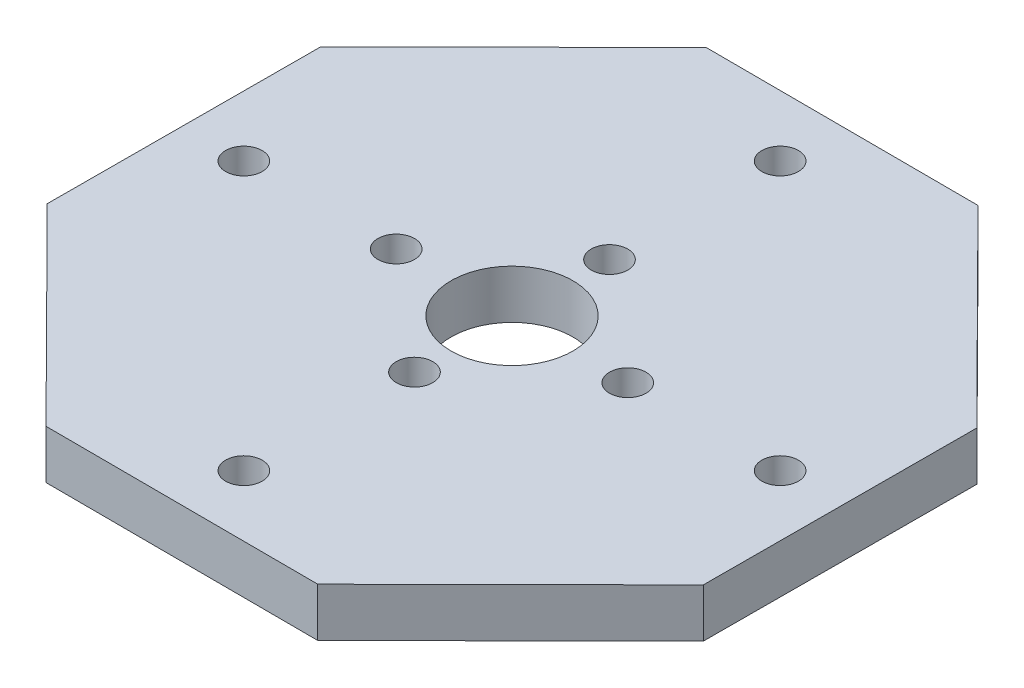
ISO-10303-21;
HEADER;
FILE_DESCRIPTION(('STEP AP214'),'2;1');
FILE_NAME('part.step','',(''),(''),'','','');
FILE_SCHEMA(('AUTOMOTIVE_DESIGN { 1 0 10303 214 1 1 1 1 }'));
ENDSEC;
DATA;
#1=APPLICATION_CONTEXT('core data for automotive mechanical design processes');
#2=APPLICATION_PROTOCOL_DEFINITION('international standard','automotive_design',2000,#1);
#3=PRODUCT_CONTEXT('',#1,'mechanical');
#4=PRODUCT('Part','Part','',(#3));
#5=PRODUCT_RELATED_PRODUCT_CATEGORY('part','',(#4));
#6=PRODUCT_DEFINITION_FORMATION('','',#4);
#7=PRODUCT_DEFINITION_CONTEXT('part definition',#1,'design');
#8=PRODUCT_DEFINITION('design','',#6,#7);
#9=PRODUCT_DEFINITION_SHAPE('','',#8);
#10=(LENGTH_UNIT() NAMED_UNIT(*) SI_UNIT(.MILLI.,.METRE.));
#11=(NAMED_UNIT(*) PLANE_ANGLE_UNIT() SI_UNIT($,.RADIAN.));
#12=(NAMED_UNIT(*) SI_UNIT($,.STERADIAN.) SOLID_ANGLE_UNIT());
#13=UNCERTAINTY_MEASURE_WITH_UNIT(LENGTH_MEASURE(1.E-05),#10,'distance_accuracy_value','');
#14=(GEOMETRIC_REPRESENTATION_CONTEXT(3) GLOBAL_UNCERTAINTY_ASSIGNED_CONTEXT((#13)) GLOBAL_UNIT_ASSIGNED_CONTEXT((#10,
#11,#12)) REPRESENTATION_CONTEXT('',''));
#15=CARTESIAN_POINT('',(0.,0.,0.));
#16=DIRECTION('',(0.,0.,1.));
#17=DIRECTION('',(1.,0.,0.));
#18=AXIS2_PLACEMENT_3D('',#15,#16,#17);
#19=CARTESIAN_POINT('',(0.,2.,0.));
#20=DIRECTION('',(0.,1.,0.));
#21=DIRECTION('',(0.,0.,1.));
#22=AXIS2_PLACEMENT_3D('',#19,#20,#21);
#23=PLANE('',#22);
#24=CARTESIAN_POINT('',(9.5,2.,0.));
#25=DIRECTION('',(0.,1.,0.));
#26=DIRECTION('',(0.,0.,1.));
#27=AXIS2_PLACEMENT_3D('',#24,#25,#26);
#28=CIRCLE('',#27,1.5);
#29=CARTESIAN_POINT('',(9.5,2.,1.5));
#30=VERTEX_POINT('',#29);
#31=EDGE_CURVE('E222',#30,#30,#28,.T.);
#32=ORIENTED_EDGE('',*,*,#31,.F.);
#33=EDGE_LOOP('',(#32));
#34=FACE_BOUND('',#33,.T.);
#35=CARTESIAN_POINT('',(-22.,2.,0.));
#36=DIRECTION('',(0.,1.,0.));
#37=DIRECTION('',(0.,0.,1.));
#38=AXIS2_PLACEMENT_3D('',#35,#36,#37);
#39=CIRCLE('',#38,1.50000000000022);
#40=CARTESIAN_POINT('',(-22.,2.,1.50000000000022));
#41=VERTEX_POINT('',#40);
#42=EDGE_CURVE('E210',#41,#41,#39,.T.);
#43=ORIENTED_EDGE('',*,*,#42,.F.);
#44=EDGE_LOOP('',(#43));
#45=FACE_BOUND('',#44,.T.);
#46=CARTESIAN_POINT('',(22.,2.,0.));
#47=DIRECTION('',(0.,1.,0.));
#48=DIRECTION('',(0.,0.,1.));
#49=AXIS2_PLACEMENT_3D('',#46,#47,#48);
#50=CIRCLE('',#49,1.50000000000008);
#51=CARTESIAN_POINT('',(22.,2.,1.50000000000008));
#52=VERTEX_POINT('',#51);
#53=EDGE_CURVE('E198',#52,#52,#50,.T.);
#54=ORIENTED_EDGE('',*,*,#53,.F.);
#55=EDGE_LOOP('',(#54));
#56=FACE_BOUND('',#55,.T.);
#57=CARTESIAN_POINT('',(0.,2.,0.));
#58=DIRECTION('',(0.,1.,0.));
#59=DIRECTION('',(0.,0.,1.));
#60=AXIS2_PLACEMENT_3D('',#57,#58,#59);
#61=CIRCLE('',#60,5.);
#62=CARTESIAN_POINT('',(0.,2.,5.));
#63=VERTEX_POINT('',#62);
#64=EDGE_CURVE('E186',#63,#63,#61,.T.);
#65=ORIENTED_EDGE('',*,*,#64,.F.);
#66=EDGE_LOOP('',(#65));
#67=FACE_BOUND('',#66,.T.);
#68=DIRECTION('',(-0.704829536822876,0.,-0.709376715167654));
#69=VECTOR('',#68,1.);
#70=CARTESIAN_POINT('',(27.0358200489824,2.,-11.0968941753564));
#71=LINE('',#70,#69);
#72=CARTESIAN_POINT('',(27.0358200489824,2.,-11.0968941753564));
#73=VERTEX_POINT('',#72);
#74=CARTESIAN_POINT('',(11.2705225700707,2.,-26.9639008130787));
#75=VERTEX_POINT('',#74);
#76=EDGE_CURVE('E149',#73,#75,#71,.T.);
#77=ORIENTED_EDGE('',*,*,#76,.T.);
#78=DIRECTION('',(-0.999994830778915,0.,-0.00321534064285705));
#79=VECTOR('',#78,1.);
#80=CARTESIAN_POINT('',(11.2705225700707,2.,-26.9639008130787));
#81=LINE('',#80,#79);
#82=CARTESIAN_POINT('',(-11.0968941753564,2.,-27.0358200489824));
#83=VERTEX_POINT('',#82);
#84=EDGE_CURVE('E97',#75,#83,#81,.T.);
#85=ORIENTED_EDGE('',*,*,#84,.T.);
#86=DIRECTION('',(-0.709376715167653,0.,0.704829536822876));
#87=VECTOR('',#86,1.);
#88=CARTESIAN_POINT('',(-11.0968941753564,2.,-27.0358200489824));
#89=LINE('',#88,#87);
#90=CARTESIAN_POINT('',(-26.9639008130787,2.,-11.2705225700707));
#91=VERTEX_POINT('',#90);
#92=EDGE_CURVE('E164',#83,#91,#89,.T.);
#93=ORIENTED_EDGE('',*,*,#92,.T.);
#94=DIRECTION('',(-0.0032153406428569,0.,0.999994830778915));
#95=VECTOR('',#94,1.);
#96=CARTESIAN_POINT('',(-26.9639008130787,2.,-11.2705225700707));
#97=LINE('',#96,#95);
#98=CARTESIAN_POINT('',(-27.0358200489824,2.,11.0968941753564));
#99=VERTEX_POINT('',#98);
#100=EDGE_CURVE('E177',#91,#99,#97,.T.);
#101=ORIENTED_EDGE('',*,*,#100,.T.);
#102=DIRECTION('',(0.704829536822876,0.,0.709376715167654));
#103=VECTOR('',#102,1.);
#104=CARTESIAN_POINT('',(-27.0358200489824,2.,11.0968941753564));
#105=LINE('',#104,#103);
#106=CARTESIAN_POINT('',(-11.2705225700707,2.,26.9639008130787));
#107=VERTEX_POINT('',#106);
#108=EDGE_CURVE('E116',#99,#107,#105,.T.);
#109=ORIENTED_EDGE('',*,*,#108,.T.);
#110=DIRECTION('',(0.999994830778915,0.,0.0032153406428569));
#111=VECTOR('',#110,1.);
#112=CARTESIAN_POINT('',(-11.2705225700707,2.,26.9639008130787));
#113=LINE('',#112,#111);
#114=CARTESIAN_POINT('',(11.0968941753564,2.,27.0358200489824));
#115=VERTEX_POINT('',#114);
#116=EDGE_CURVE('E110',#107,#115,#113,.T.);
#117=ORIENTED_EDGE('',*,*,#116,.T.);
#118=DIRECTION('',(0.709376715167654,0.,-0.704829536822876));
#119=VECTOR('',#118,1.);
#120=CARTESIAN_POINT('',(11.0968941753564,2.,27.0358200489824));
#121=LINE('',#120,#119);
#122=CARTESIAN_POINT('',(26.9639008130787,2.,11.2705225700707));
#123=VERTEX_POINT('',#122);
#124=EDGE_CURVE('E114',#115,#123,#121,.T.);
#125=ORIENTED_EDGE('',*,*,#124,.T.);
#126=DIRECTION('',(0.00321534064285705,0.,-0.999994830778915));
#127=VECTOR('',#126,1.);
#128=CARTESIAN_POINT('',(26.9639008130787,2.,11.2705225700707));
#129=LINE('',#128,#127);
#130=EDGE_CURVE('E54',#123,#73,#129,.T.);
#131=ORIENTED_EDGE('',*,*,#130,.T.);
#132=EDGE_LOOP('',(#77,#85,#93,#101,#109,#117,#125,#131));
#133=FACE_BOUND('',#132,.T.);
#134=CARTESIAN_POINT('',(0.,2.,-22.));
#135=DIRECTION('',(0.,1.,0.));
#136=DIRECTION('',(0.,0.,1.));
#137=AXIS2_PLACEMENT_3D('',#134,#135,#136);
#138=CIRCLE('',#137,1.5);
#139=CARTESIAN_POINT('',(0.,2.,-20.5));
#140=VERTEX_POINT('',#139);
#141=EDGE_CURVE('E138',#140,#140,#138,.T.);
#142=ORIENTED_EDGE('',*,*,#141,.F.);
#143=EDGE_LOOP('',(#142));
#144=FACE_BOUND('',#143,.T.);
#145=CARTESIAN_POINT('',(-9.5,2.,0.));
#146=DIRECTION('',(0.,1.,0.));
#147=DIRECTION('',(0.,0.,1.));
#148=AXIS2_PLACEMENT_3D('',#145,#146,#147);
#149=CIRCLE('',#148,1.5);
#150=CARTESIAN_POINT('',(-9.5,2.,1.5));
#151=VERTEX_POINT('',#150);
#152=EDGE_CURVE('E192',#151,#151,#149,.T.);
#153=ORIENTED_EDGE('',*,*,#152,.F.);
#154=EDGE_LOOP('',(#153));
#155=FACE_BOUND('',#154,.T.);
#156=CARTESIAN_POINT('',(0.,2.,22.));
#157=DIRECTION('',(0.,1.,0.));
#158=DIRECTION('',(0.,0.,1.));
#159=AXIS2_PLACEMENT_3D('',#156,#157,#158);
#160=CIRCLE('',#159,1.50000000000015);
#161=CARTESIAN_POINT('',(0.,2.,23.5000000000001));
#162=VERTEX_POINT('',#161);
#163=EDGE_CURVE('E204',#162,#162,#160,.T.);
#164=ORIENTED_EDGE('',*,*,#163,.F.);
#165=EDGE_LOOP('',(#164));
#166=FACE_BOUND('',#165,.T.);
#167=CARTESIAN_POINT('',(0.,2.,8.));
#168=DIRECTION('',(0.,1.,0.));
#169=DIRECTION('',(0.,0.,1.));
#170=AXIS2_PLACEMENT_3D('',#167,#168,#169);
#171=CIRCLE('',#170,1.5);
#172=CARTESIAN_POINT('',(0.,2.,9.5));
#173=VERTEX_POINT('',#172);
#174=EDGE_CURVE('E216',#173,#173,#171,.T.);
#175=ORIENTED_EDGE('',*,*,#174,.F.);
#176=EDGE_LOOP('',(#175));
#177=FACE_BOUND('',#176,.T.);
#178=CARTESIAN_POINT('',(0.,2.,-8.));
#179=DIRECTION('',(0.,1.,0.));
#180=DIRECTION('',(0.,0.,1.));
#181=AXIS2_PLACEMENT_3D('',#178,#179,#180);
#182=CIRCLE('',#181,1.5);
#183=CARTESIAN_POINT('',(0.,2.,-6.5));
#184=VERTEX_POINT('',#183);
#185=EDGE_CURVE('E228',#184,#184,#182,.T.);
#186=ORIENTED_EDGE('',*,*,#185,.F.);
#187=EDGE_LOOP('',(#186));
#188=FACE_BOUND('',#187,.T.);
#189=ADVANCED_FACE('F37',(#34,#45,#56,#67,#133,#144,#155,#166,#177,#188),#23,.T.);
#190=CARTESIAN_POINT('',(0.,-2.,0.));
#191=DIRECTION('',(0.,1.,0.));
#192=DIRECTION('',(0.,0.,1.));
#193=AXIS2_PLACEMENT_3D('',#190,#191,#192);
#194=PLANE('',#193);
#195=DIRECTION('',(-0.704829536822876,0.,-0.709376715167654));
#196=VECTOR('',#195,1.);
#197=CARTESIAN_POINT('',(27.0358200489824,-2.,-11.0968941753564));
#198=LINE('',#197,#196);
#199=CARTESIAN_POINT('',(27.0358200489824,-2.,-11.0968941753564));
#200=VERTEX_POINT('',#199);
#201=CARTESIAN_POINT('',(11.2705225700707,-2.,-26.9639008130787));
#202=VERTEX_POINT('',#201);
#203=EDGE_CURVE('E134',#200,#202,#198,.T.);
#204=ORIENTED_EDGE('',*,*,#203,.F.);
#205=DIRECTION('',(0.00321534064285705,0.,-0.999994830778915));
#206=VECTOR('',#205,1.);
#207=CARTESIAN_POINT('',(26.9639008130787,-2.,11.2705225700707));
#208=LINE('',#207,#206);
#209=CARTESIAN_POINT('',(26.9639008130787,-2.,11.2705225700707));
#210=VERTEX_POINT('',#209);
#211=EDGE_CURVE('E89',#210,#200,#208,.T.);
#212=ORIENTED_EDGE('',*,*,#211,.F.);
#213=DIRECTION('',(0.709376715167654,0.,-0.704829536822876));
#214=VECTOR('',#213,1.);
#215=CARTESIAN_POINT('',(11.0968941753564,-2.,27.0358200489824));
#216=LINE('',#215,#214);
#217=CARTESIAN_POINT('',(11.0968941753564,-2.,27.0358200489824));
#218=VERTEX_POINT('',#217);
#219=EDGE_CURVE('E83',#218,#210,#216,.T.);
#220=ORIENTED_EDGE('',*,*,#219,.F.);
#221=DIRECTION('',(0.999994830778915,0.,0.0032153406428569));
#222=VECTOR('',#221,1.);
#223=CARTESIAN_POINT('',(-11.2705225700707,-2.,26.9639008130787));
#224=LINE('',#223,#222);
#225=CARTESIAN_POINT('',(-11.2705225700707,-2.,26.9639008130787));
#226=VERTEX_POINT('',#225);
#227=EDGE_CURVE('E124',#226,#218,#224,.T.);
#228=ORIENTED_EDGE('',*,*,#227,.F.);
#229=DIRECTION('',(0.704829536822876,0.,0.709376715167654));
#230=VECTOR('',#229,1.);
#231=CARTESIAN_POINT('',(-27.0358200489824,-2.,11.0968941753564));
#232=LINE('',#231,#230);
#233=CARTESIAN_POINT('',(-27.0358200489824,-2.,11.0968941753564));
#234=VERTEX_POINT('',#233);
#235=EDGE_CURVE('E144',#234,#226,#232,.T.);
#236=ORIENTED_EDGE('',*,*,#235,.F.);
#237=DIRECTION('',(-0.0032153406428569,0.,0.999994830778915));
#238=VECTOR('',#237,1.);
#239=CARTESIAN_POINT('',(-26.9639008130787,-2.,-11.2705225700707));
#240=LINE('',#239,#238);
#241=CARTESIAN_POINT('',(-26.9639008130787,-2.,-11.2705225700707));
#242=VERTEX_POINT('',#241);
#243=EDGE_CURVE('E142',#242,#234,#240,.T.);
#244=ORIENTED_EDGE('',*,*,#243,.F.);
#245=DIRECTION('',(-0.709376715167653,0.,0.704829536822876));
#246=VECTOR('',#245,1.);
#247=CARTESIAN_POINT('',(-11.0968941753564,-2.,-27.0358200489824));
#248=LINE('',#247,#246);
#249=CARTESIAN_POINT('',(-11.0968941753564,-2.,-27.0358200489824));
#250=VERTEX_POINT('',#249);
#251=EDGE_CURVE('E140',#250,#242,#248,.T.);
#252=ORIENTED_EDGE('',*,*,#251,.F.);
#253=DIRECTION('',(-0.999994830778915,0.,-0.00321534064285705));
#254=VECTOR('',#253,1.);
#255=CARTESIAN_POINT('',(11.2705225700707,-2.,-26.9639008130787));
#256=LINE('',#255,#254);
#257=EDGE_CURVE('E137',#202,#250,#256,.T.);
#258=ORIENTED_EDGE('',*,*,#257,.F.);
#259=EDGE_LOOP('',(#204,#212,#220,#228,#236,#244,#252,#258));
#260=FACE_BOUND('',#259,.T.);
#261=CARTESIAN_POINT('',(0.,-2.,-22.));
#262=DIRECTION('',(0.,1.,0.));
#263=DIRECTION('',(0.,0.,1.));
#264=AXIS2_PLACEMENT_3D('',#261,#262,#263);
#265=CIRCLE('',#264,1.5);
#266=CARTESIAN_POINT('',(0.,-2.,-20.5));
#267=VERTEX_POINT('',#266);
#268=EDGE_CURVE('E183',#267,#267,#265,.T.);
#269=ORIENTED_EDGE('',*,*,#268,.T.);
#270=EDGE_LOOP('',(#269));
#271=FACE_BOUND('',#270,.T.);
#272=CARTESIAN_POINT('',(0.,-2.,0.));
#273=DIRECTION('',(0.,1.,0.));
#274=DIRECTION('',(0.,0.,1.));
#275=AXIS2_PLACEMENT_3D('',#272,#273,#274);
#276=CIRCLE('',#275,5.);
#277=CARTESIAN_POINT('',(0.,-2.,5.));
#278=VERTEX_POINT('',#277);
#279=EDGE_CURVE('E189',#278,#278,#276,.T.);
#280=ORIENTED_EDGE('',*,*,#279,.T.);
#281=EDGE_LOOP('',(#280));
#282=FACE_BOUND('',#281,.T.);
#283=CARTESIAN_POINT('',(-9.5,-2.,0.));
#284=DIRECTION('',(0.,1.,0.));
#285=DIRECTION('',(0.,0.,1.));
#286=AXIS2_PLACEMENT_3D('',#283,#284,#285);
#287=CIRCLE('',#286,1.5);
#288=CARTESIAN_POINT('',(-9.5,-2.,1.5));
#289=VERTEX_POINT('',#288);
#290=EDGE_CURVE('E195',#289,#289,#287,.T.);
#291=ORIENTED_EDGE('',*,*,#290,.T.);
#292=EDGE_LOOP('',(#291));
#293=FACE_BOUND('',#292,.T.);
#294=CARTESIAN_POINT('',(22.,-2.,0.));
#295=DIRECTION('',(0.,1.,0.));
#296=DIRECTION('',(0.,0.,1.));
#297=AXIS2_PLACEMENT_3D('',#294,#295,#296);
#298=CIRCLE('',#297,1.50000000000008);
#299=CARTESIAN_POINT('',(22.,-2.,1.50000000000008));
#300=VERTEX_POINT('',#299);
#301=EDGE_CURVE('E201',#300,#300,#298,.T.);
#302=ORIENTED_EDGE('',*,*,#301,.T.);
#303=EDGE_LOOP('',(#302));
#304=FACE_BOUND('',#303,.T.);
#305=CARTESIAN_POINT('',(0.,-2.,22.));
#306=DIRECTION('',(0.,1.,0.));
#307=DIRECTION('',(0.,0.,1.));
#308=AXIS2_PLACEMENT_3D('',#305,#306,#307);
#309=CIRCLE('',#308,1.50000000000015);
#310=CARTESIAN_POINT('',(0.,-2.,23.5000000000001));
#311=VERTEX_POINT('',#310);
#312=EDGE_CURVE('E207',#311,#311,#309,.T.);
#313=ORIENTED_EDGE('',*,*,#312,.T.);
#314=EDGE_LOOP('',(#313));
#315=FACE_BOUND('',#314,.T.);
#316=CARTESIAN_POINT('',(-22.,-2.,0.));
#317=DIRECTION('',(0.,1.,0.));
#318=DIRECTION('',(0.,0.,1.));
#319=AXIS2_PLACEMENT_3D('',#316,#317,#318);
#320=CIRCLE('',#319,1.50000000000022);
#321=CARTESIAN_POINT('',(-22.,-2.,1.50000000000022));
#322=VERTEX_POINT('',#321);
#323=EDGE_CURVE('E213',#322,#322,#320,.T.);
#324=ORIENTED_EDGE('',*,*,#323,.T.);
#325=EDGE_LOOP('',(#324));
#326=FACE_BOUND('',#325,.T.);
#327=CARTESIAN_POINT('',(0.,-2.,8.));
#328=DIRECTION('',(0.,1.,0.));
#329=DIRECTION('',(0.,0.,1.));
#330=AXIS2_PLACEMENT_3D('',#327,#328,#329);
#331=CIRCLE('',#330,1.5);
#332=CARTESIAN_POINT('',(0.,-2.,9.5));
#333=VERTEX_POINT('',#332);
#334=EDGE_CURVE('E219',#333,#333,#331,.T.);
#335=ORIENTED_EDGE('',*,*,#334,.T.);
#336=EDGE_LOOP('',(#335));
#337=FACE_BOUND('',#336,.T.);
#338=CARTESIAN_POINT('',(9.5,-2.,0.));
#339=DIRECTION('',(0.,1.,0.));
#340=DIRECTION('',(0.,0.,1.));
#341=AXIS2_PLACEMENT_3D('',#338,#339,#340);
#342=CIRCLE('',#341,1.5);
#343=CARTESIAN_POINT('',(9.5,-2.,1.5));
#344=VERTEX_POINT('',#343);
#345=EDGE_CURVE('E225',#344,#344,#342,.T.);
#346=ORIENTED_EDGE('',*,*,#345,.T.);
#347=EDGE_LOOP('',(#346));
#348=FACE_BOUND('',#347,.T.);
#349=CARTESIAN_POINT('',(0.,-2.,-8.));
#350=DIRECTION('',(0.,1.,0.));
#351=DIRECTION('',(0.,0.,1.));
#352=AXIS2_PLACEMENT_3D('',#349,#350,#351);
#353=CIRCLE('',#352,1.5);
#354=CARTESIAN_POINT('',(0.,-2.,-6.5));
#355=VERTEX_POINT('',#354);
#356=EDGE_CURVE('E231',#355,#355,#353,.T.);
#357=ORIENTED_EDGE('',*,*,#356,.T.);
#358=EDGE_LOOP('',(#357));
#359=FACE_BOUND('',#358,.T.);
#360=ADVANCED_FACE('F168',(#260,#271,#282,#293,#304,#315,#326,#337,#348,#359),#194,.F.);
#361=CARTESIAN_POINT('',(27.0358200489824,2.,-11.0968941753564));
#362=DIRECTION('',(-0.709376715167654,0.,0.704829536822876));
#363=DIRECTION('',(0.704829536822876,0.,0.709376715167654));
#364=AXIS2_PLACEMENT_3D('',#361,#362,#363);
#365=PLANE('',#364);
#366=ORIENTED_EDGE('',*,*,#203,.T.);
#367=DIRECTION('',(0.,-1.,0.));
#368=VECTOR('',#367,1.);
#369=CARTESIAN_POINT('',(11.2705225700707,2.,-26.9639008130787));
#370=LINE('',#369,#368);
#371=EDGE_CURVE('E11',#75,#202,#370,.T.);
#372=ORIENTED_EDGE('',*,*,#371,.F.);
#373=ORIENTED_EDGE('',*,*,#76,.F.);
#374=DIRECTION('',(0.,-1.,0.));
#375=VECTOR('',#374,1.);
#376=CARTESIAN_POINT('',(27.0358200489824,2.,-11.0968941753564));
#377=LINE('',#376,#375);
#378=EDGE_CURVE('E130',#73,#200,#377,.T.);
#379=ORIENTED_EDGE('',*,*,#378,.T.);
#380=EDGE_LOOP('',(#366,#372,#373,#379));
#381=FACE_BOUND('',#380,.T.);
#382=ADVANCED_FACE('F39',(#381),#365,.F.);
#383=CARTESIAN_POINT('',(11.2705225700707,2.,-26.9639008130787));
#384=DIRECTION('',(-0.00321534064285705,0.,0.999994830778915));
#385=DIRECTION('',(0.999994830778915,0.,0.00321534064285705));
#386=AXIS2_PLACEMENT_3D('',#383,#384,#385);
#387=PLANE('',#386);
#388=ORIENTED_EDGE('',*,*,#257,.T.);
#389=DIRECTION('',(0.,-1.,0.));
#390=VECTOR('',#389,1.);
#391=CARTESIAN_POINT('',(-11.0968941753564,2.,-27.0358200489824));
#392=LINE('',#391,#390);
#393=EDGE_CURVE('E46',#83,#250,#392,.T.);
#394=ORIENTED_EDGE('',*,*,#393,.F.);
#395=ORIENTED_EDGE('',*,*,#84,.F.);
#396=ORIENTED_EDGE('',*,*,#371,.T.);
#397=EDGE_LOOP('',(#388,#394,#395,#396));
#398=FACE_BOUND('',#397,.T.);
#399=ADVANCED_FACE('F265',(#398),#387,.F.);
#400=CARTESIAN_POINT('',(-11.0968941753564,2.,-27.0358200489824));
#401=DIRECTION('',(0.704829536822876,0.,0.709376715167653));
#402=DIRECTION('',(0.709376715167653,0.,-0.704829536822876));
#403=AXIS2_PLACEMENT_3D('',#400,#401,#402);
#404=PLANE('',#403);
#405=ORIENTED_EDGE('',*,*,#251,.T.);
#406=DIRECTION('',(0.,-1.,0.));
#407=VECTOR('',#406,1.);
#408=CARTESIAN_POINT('',(-26.9639008130787,2.,-11.2705225700707));
#409=LINE('',#408,#407);
#410=EDGE_CURVE('E156',#91,#242,#409,.T.);
#411=ORIENTED_EDGE('',*,*,#410,.F.);
#412=ORIENTED_EDGE('',*,*,#92,.F.);
#413=ORIENTED_EDGE('',*,*,#393,.T.);
#414=EDGE_LOOP('',(#405,#411,#412,#413));
#415=FACE_BOUND('',#414,.T.);
#416=ADVANCED_FACE('F162',(#415),#404,.F.);
#417=CARTESIAN_POINT('',(-26.9639008130787,2.,-11.2705225700707));
#418=DIRECTION('',(0.999994830778915,0.,0.0032153406428569));
#419=DIRECTION('',(0.0032153406428569,0.,-0.999994830778915));
#420=AXIS2_PLACEMENT_3D('',#417,#418,#419);
#421=PLANE('',#420);
#422=ORIENTED_EDGE('',*,*,#243,.T.);
#423=DIRECTION('',(0.,-1.,0.));
#424=VECTOR('',#423,1.);
#425=CARTESIAN_POINT('',(-27.0358200489824,2.,11.0968941753564));
#426=LINE('',#425,#424);
#427=EDGE_CURVE('E153',#99,#234,#426,.T.);
#428=ORIENTED_EDGE('',*,*,#427,.F.);
#429=ORIENTED_EDGE('',*,*,#100,.F.);
#430=ORIENTED_EDGE('',*,*,#410,.T.);
#431=EDGE_LOOP('',(#422,#428,#429,#430));
#432=FACE_BOUND('',#431,.T.);
#433=ADVANCED_FACE('F173',(#432),#421,.F.);
#434=CARTESIAN_POINT('',(-27.0358200489824,2.,11.0968941753564));
#435=DIRECTION('',(0.709376715167654,0.,-0.704829536822876));
#436=DIRECTION('',(-0.704829536822876,0.,-0.709376715167654));
#437=AXIS2_PLACEMENT_3D('',#434,#435,#436);
#438=PLANE('',#437);
#439=ORIENTED_EDGE('',*,*,#235,.T.);
#440=DIRECTION('',(0.,-1.,0.));
#441=VECTOR('',#440,1.);
#442=CARTESIAN_POINT('',(-11.2705225700707,2.,26.9639008130787));
#443=LINE('',#442,#441);
#444=EDGE_CURVE('E125',#107,#226,#443,.T.);
#445=ORIENTED_EDGE('',*,*,#444,.F.);
#446=ORIENTED_EDGE('',*,*,#108,.F.);
#447=ORIENTED_EDGE('',*,*,#427,.T.);
#448=EDGE_LOOP('',(#439,#445,#446,#447));
#449=FACE_BOUND('',#448,.T.);
#450=ADVANCED_FACE('F176',(#449),#438,.F.);
#451=CARTESIAN_POINT('',(-11.2705225700707,2.,26.9639008130787));
#452=DIRECTION('',(0.0032153406428569,0.,-0.999994830778915));
#453=DIRECTION('',(-0.999994830778915,0.,-0.0032153406428569));
#454=AXIS2_PLACEMENT_3D('',#451,#452,#453);
#455=PLANE('',#454);
#456=ORIENTED_EDGE('',*,*,#227,.T.);
#457=DIRECTION('',(0.,-1.,0.));
#458=VECTOR('',#457,1.);
#459=CARTESIAN_POINT('',(11.0968941753564,2.,27.0358200489824));
#460=LINE('',#459,#458);
#461=EDGE_CURVE('E121',#115,#218,#460,.T.);
#462=ORIENTED_EDGE('',*,*,#461,.F.);
#463=ORIENTED_EDGE('',*,*,#116,.F.);
#464=ORIENTED_EDGE('',*,*,#444,.T.);
#465=EDGE_LOOP('',(#456,#462,#463,#464));
#466=FACE_BOUND('',#465,.T.);
#467=ADVANCED_FACE('F122',(#466),#455,.F.);
#468=CARTESIAN_POINT('',(11.0968941753564,2.,27.0358200489824));
#469=DIRECTION('',(-0.704829536822876,0.,-0.709376715167654));
#470=DIRECTION('',(-0.709376715167654,0.,0.704829536822876));
#471=AXIS2_PLACEMENT_3D('',#468,#469,#470);
#472=PLANE('',#471);
#473=ORIENTED_EDGE('',*,*,#219,.T.);
#474=DIRECTION('',(0.,-1.,0.));
#475=VECTOR('',#474,1.);
#476=CARTESIAN_POINT('',(26.9639008130787,2.,11.2705225700707));
#477=LINE('',#476,#475);
#478=EDGE_CURVE('E126',#123,#210,#477,.T.);
#479=ORIENTED_EDGE('',*,*,#478,.F.);
#480=ORIENTED_EDGE('',*,*,#124,.F.);
#481=ORIENTED_EDGE('',*,*,#461,.T.);
#482=EDGE_LOOP('',(#473,#479,#480,#481));
#483=FACE_BOUND('',#482,.T.);
#484=ADVANCED_FACE('F128',(#483),#472,.F.);
#485=CARTESIAN_POINT('',(26.9639008130787,2.,11.2705225700707));
#486=DIRECTION('',(-0.999994830778915,0.,-0.00321534064285705));
#487=DIRECTION('',(-0.00321534064285705,0.,0.999994830778915));
#488=AXIS2_PLACEMENT_3D('',#485,#486,#487);
#489=PLANE('',#488);
#490=ORIENTED_EDGE('',*,*,#211,.T.);
#491=ORIENTED_EDGE('',*,*,#378,.F.);
#492=ORIENTED_EDGE('',*,*,#130,.F.);
#493=ORIENTED_EDGE('',*,*,#478,.T.);
#494=EDGE_LOOP('',(#490,#491,#492,#493));
#495=FACE_BOUND('',#494,.T.);
#496=ADVANCED_FACE('F253',(#495),#489,.F.);
#497=CARTESIAN_POINT('',(0.,2.,-22.));
#498=DIRECTION('',(0.,-1.,0.));
#499=DIRECTION('',(0.,0.,-1.));
#500=AXIS2_PLACEMENT_3D('',#497,#498,#499);
#501=CYLINDRICAL_SURFACE('',#500,1.5);
#502=ORIENTED_EDGE('',*,*,#141,.T.);
#503=EDGE_LOOP('',(#502));
#504=FACE_BOUND('',#503,.T.);
#505=ORIENTED_EDGE('',*,*,#268,.F.);
#506=EDGE_LOOP('',(#505));
#507=FACE_BOUND('',#506,.T.);
#508=ADVANCED_FACE('F250',(#504,#507),#501,.F.);
#509=CARTESIAN_POINT('',(0.,2.,0.));
#510=DIRECTION('',(0.,-1.,0.));
#511=DIRECTION('',(0.,0.,-1.));
#512=AXIS2_PLACEMENT_3D('',#509,#510,#511);
#513=CYLINDRICAL_SURFACE('',#512,5.);
#514=ORIENTED_EDGE('',*,*,#64,.T.);
#515=EDGE_LOOP('',(#514));
#516=FACE_BOUND('',#515,.T.);
#517=ORIENTED_EDGE('',*,*,#279,.F.);
#518=EDGE_LOOP('',(#517));
#519=FACE_BOUND('',#518,.T.);
#520=ADVANCED_FACE('F329',(#516,#519),#513,.F.);
#521=CARTESIAN_POINT('',(-9.5,2.,0.));
#522=DIRECTION('',(0.,-1.,0.));
#523=DIRECTION('',(0.,0.,-1.));
#524=AXIS2_PLACEMENT_3D('',#521,#522,#523);
#525=CYLINDRICAL_SURFACE('',#524,1.5);
#526=ORIENTED_EDGE('',*,*,#152,.T.);
#527=EDGE_LOOP('',(#526));
#528=FACE_BOUND('',#527,.T.);
#529=ORIENTED_EDGE('',*,*,#290,.F.);
#530=EDGE_LOOP('',(#529));
#531=FACE_BOUND('',#530,.T.);
#532=ADVANCED_FACE('F337',(#528,#531),#525,.F.);
#533=CARTESIAN_POINT('',(22.,2.,0.));
#534=DIRECTION('',(0.,-1.,0.));
#535=DIRECTION('',(0.,0.,-1.));
#536=AXIS2_PLACEMENT_3D('',#533,#534,#535);
#537=CYLINDRICAL_SURFACE('',#536,1.50000000000008);
#538=ORIENTED_EDGE('',*,*,#53,.T.);
#539=EDGE_LOOP('',(#538));
#540=FACE_BOUND('',#539,.T.);
#541=ORIENTED_EDGE('',*,*,#301,.F.);
#542=EDGE_LOOP('',(#541));
#543=FACE_BOUND('',#542,.T.);
#544=ADVANCED_FACE('F345',(#540,#543),#537,.F.);
#545=CARTESIAN_POINT('',(0.,2.,22.));
#546=DIRECTION('',(0.,-1.,0.));
#547=DIRECTION('',(0.,0.,-1.));
#548=AXIS2_PLACEMENT_3D('',#545,#546,#547);
#549=CYLINDRICAL_SURFACE('',#548,1.50000000000015);
#550=ORIENTED_EDGE('',*,*,#163,.T.);
#551=EDGE_LOOP('',(#550));
#552=FACE_BOUND('',#551,.T.);
#553=ORIENTED_EDGE('',*,*,#312,.F.);
#554=EDGE_LOOP('',(#553));
#555=FACE_BOUND('',#554,.T.);
#556=ADVANCED_FACE('F354',(#552,#555),#549,.F.);
#557=CARTESIAN_POINT('',(-22.,2.,0.));
#558=DIRECTION('',(0.,-1.,0.));
#559=DIRECTION('',(0.,0.,-1.));
#560=AXIS2_PLACEMENT_3D('',#557,#558,#559);
#561=CYLINDRICAL_SURFACE('',#560,1.50000000000022);
#562=ORIENTED_EDGE('',*,*,#42,.T.);
#563=EDGE_LOOP('',(#562));
#564=FACE_BOUND('',#563,.T.);
#565=ORIENTED_EDGE('',*,*,#323,.F.);
#566=EDGE_LOOP('',(#565));
#567=FACE_BOUND('',#566,.T.);
#568=ADVANCED_FACE('F363',(#564,#567),#561,.F.);
#569=CARTESIAN_POINT('',(0.,2.,8.));
#570=DIRECTION('',(0.,-1.,0.));
#571=DIRECTION('',(0.,0.,-1.));
#572=AXIS2_PLACEMENT_3D('',#569,#570,#571);
#573=CYLINDRICAL_SURFACE('',#572,1.5);
#574=ORIENTED_EDGE('',*,*,#174,.T.);
#575=EDGE_LOOP('',(#574));
#576=FACE_BOUND('',#575,.T.);
#577=ORIENTED_EDGE('',*,*,#334,.F.);
#578=EDGE_LOOP('',(#577));
#579=FACE_BOUND('',#578,.T.);
#580=ADVANCED_FACE('F372',(#576,#579),#573,.F.);
#581=CARTESIAN_POINT('',(9.5,2.,0.));
#582=DIRECTION('',(0.,-1.,0.));
#583=DIRECTION('',(0.,0.,-1.));
#584=AXIS2_PLACEMENT_3D('',#581,#582,#583);
#585=CYLINDRICAL_SURFACE('',#584,1.5);
#586=ORIENTED_EDGE('',*,*,#31,.T.);
#587=EDGE_LOOP('',(#586));
#588=FACE_BOUND('',#587,.T.);
#589=ORIENTED_EDGE('',*,*,#345,.F.);
#590=EDGE_LOOP('',(#589));
#591=FACE_BOUND('',#590,.T.);
#592=ADVANCED_FACE('F381',(#588,#591),#585,.F.);
#593=CARTESIAN_POINT('',(0.,2.,-8.));
#594=DIRECTION('',(0.,-1.,0.));
#595=DIRECTION('',(0.,0.,-1.));
#596=AXIS2_PLACEMENT_3D('',#593,#594,#595);
#597=CYLINDRICAL_SURFACE('',#596,1.5);
#598=ORIENTED_EDGE('',*,*,#185,.T.);
#599=EDGE_LOOP('',(#598));
#600=FACE_BOUND('',#599,.T.);
#601=ORIENTED_EDGE('',*,*,#356,.F.);
#602=EDGE_LOOP('',(#601));
#603=FACE_BOUND('',#602,.T.);
#604=ADVANCED_FACE('F237',(#600,#603),#597,.F.);
#605=CLOSED_SHELL('',(#189,#360,#382,#399,#416,#433,#450,#467,#484,#496,#508,#520,#532,#544,
#556,#568,#580,#592,#604));
#606=MANIFOLD_SOLID_BREP('B2',#605);
#607=ADVANCED_BREP_SHAPE_REPRESENTATION('',(#18,#606),#14);
#608=SHAPE_DEFINITION_REPRESENTATION(#9,#607);
ENDSEC;
END-ISO-10303-21;
